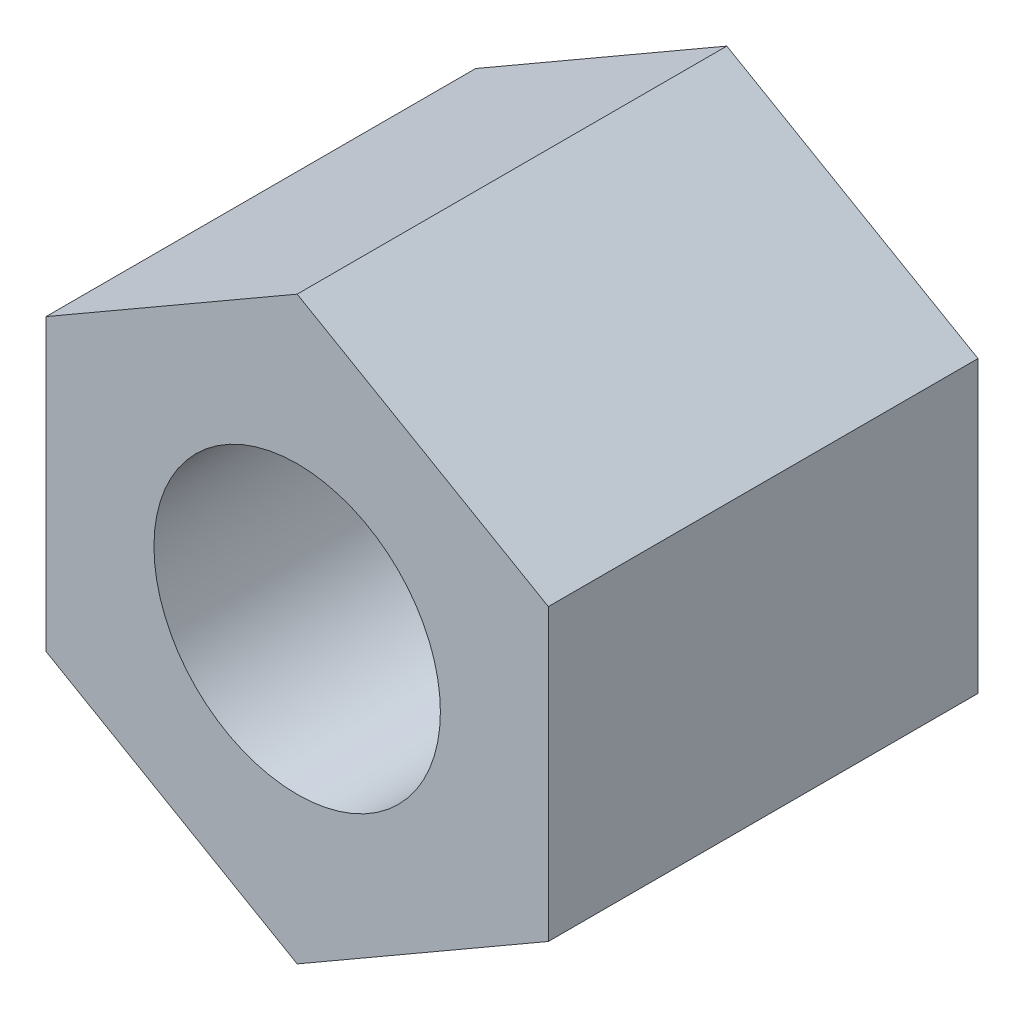
ISO-10303-21;
HEADER;
FILE_DESCRIPTION(('STEP AP214'),'2;1');
FILE_NAME('part.step','',(''),(''),'','','');
FILE_SCHEMA(('AUTOMOTIVE_DESIGN { 1 0 10303 214 1 1 1 1 }'));
ENDSEC;
DATA;
#1=APPLICATION_CONTEXT('core data for automotive mechanical design processes');
#2=APPLICATION_PROTOCOL_DEFINITION('international standard','automotive_design',2000,#1);
#3=PRODUCT_CONTEXT('',#1,'mechanical');
#4=PRODUCT('Part','Part','',(#3));
#5=PRODUCT_RELATED_PRODUCT_CATEGORY('part','',(#4));
#6=PRODUCT_DEFINITION_FORMATION('','',#4);
#7=PRODUCT_DEFINITION_CONTEXT('part definition',#1,'design');
#8=PRODUCT_DEFINITION('design','',#6,#7);
#9=PRODUCT_DEFINITION_SHAPE('','',#8);
#10=(LENGTH_UNIT() NAMED_UNIT(*) SI_UNIT(.MILLI.,.METRE.));
#11=(NAMED_UNIT(*) PLANE_ANGLE_UNIT() SI_UNIT($,.RADIAN.));
#12=(NAMED_UNIT(*) SI_UNIT($,.STERADIAN.) SOLID_ANGLE_UNIT());
#13=UNCERTAINTY_MEASURE_WITH_UNIT(LENGTH_MEASURE(1.E-05),#10,'distance_accuracy_value','');
#14=(GEOMETRIC_REPRESENTATION_CONTEXT(3) GLOBAL_UNCERTAINTY_ASSIGNED_CONTEXT((#13)) GLOBAL_UNIT_ASSIGNED_CONTEXT((#10,
#11,#12)) REPRESENTATION_CONTEXT('',''));
#15=CARTESIAN_POINT('',(0.,0.,0.));
#16=DIRECTION('',(0.,0.,1.));
#17=DIRECTION('',(1.,0.,0.));
#18=AXIS2_PLACEMENT_3D('',#15,#16,#17);
#19=CARTESIAN_POINT('',(1.75370144266349,3.0375,6.));
#20=DIRECTION('',(-0.5,-0.866025403784438,0.));
#21=DIRECTION('',(0.866025403784439,-0.5,0.));
#22=AXIS2_PLACEMENT_3D('',#19,#20,#21);
#23=PLANE('',#22);
#24=DIRECTION('',(-0.866025403784439,0.5,0.));
#25=VECTOR('',#24,1.);
#26=CARTESIAN_POINT('',(1.75370144266349,3.0375,0.));
#27=LINE('',#26,#25);
#28=CARTESIAN_POINT('',(3.50740288532697,2.025,0.));
#29=VERTEX_POINT('',#28);
#30=CARTESIAN_POINT('',(0.,4.05,0.));
#31=VERTEX_POINT('',#30);
#32=EDGE_CURVE('E129',#29,#31,#27,.T.);
#33=ORIENTED_EDGE('',*,*,#32,.T.);
#34=DIRECTION('',(0.,0.,-1.));
#35=VECTOR('',#34,1.);
#36=CARTESIAN_POINT('',(0.,4.05,6.));
#37=LINE('',#36,#35);
#38=CARTESIAN_POINT('',(0.,4.05,6.));
#39=VERTEX_POINT('',#38);
#40=EDGE_CURVE('E11',#39,#31,#37,.T.);
#41=ORIENTED_EDGE('',*,*,#40,.F.);
#42=DIRECTION('',(-0.866025403784439,0.5,0.));
#43=VECTOR('',#42,1.);
#44=CARTESIAN_POINT('',(1.75370144266349,3.0375,6.));
#45=LINE('',#44,#43);
#46=CARTESIAN_POINT('',(3.50740288532697,2.025,6.));
#47=VERTEX_POINT('',#46);
#48=EDGE_CURVE('E142',#47,#39,#45,.T.);
#49=ORIENTED_EDGE('',*,*,#48,.F.);
#50=DIRECTION('',(0.,0.,-1.));
#51=VECTOR('',#50,1.);
#52=CARTESIAN_POINT('',(3.50740288532697,2.025,6.));
#53=LINE('',#52,#51);
#54=EDGE_CURVE('E128',#47,#29,#53,.T.);
#55=ORIENTED_EDGE('',*,*,#54,.T.);
#56=EDGE_LOOP('',(#33,#41,#49,#55));
#57=FACE_BOUND('',#56,.T.);
#58=ADVANCED_FACE('F41',(#57),#23,.F.);
#59=CARTESIAN_POINT('',(-1.75370144266348,3.0375,6.));
#60=DIRECTION('',(0.499999999999999,-0.866025403784439,0.));
#61=DIRECTION('',(0.866025403784439,0.499999999999999,0.));
#62=AXIS2_PLACEMENT_3D('',#59,#60,#61);
#63=PLANE('',#62);
#64=DIRECTION('',(-0.86602540378444,-0.499999999999999,0.));
#65=VECTOR('',#64,1.);
#66=CARTESIAN_POINT('',(-1.75370144266348,3.0375,0.));
#67=LINE('',#66,#65);
#68=CARTESIAN_POINT('',(-3.50740288532698,2.025,0.));
#69=VERTEX_POINT('',#68);
#70=EDGE_CURVE('E132',#31,#69,#67,.T.);
#71=ORIENTED_EDGE('',*,*,#70,.T.);
#72=DIRECTION('',(0.,0.,-1.));
#73=VECTOR('',#72,1.);
#74=CARTESIAN_POINT('',(-3.50740288532698,2.025,6.));
#75=LINE('',#74,#73);
#76=CARTESIAN_POINT('',(-3.50740288532698,2.025,6.));
#77=VERTEX_POINT('',#76);
#78=EDGE_CURVE('E49',#77,#69,#75,.T.);
#79=ORIENTED_EDGE('',*,*,#78,.F.);
#80=DIRECTION('',(-0.86602540378444,-0.499999999999999,0.));
#81=VECTOR('',#80,1.);
#82=CARTESIAN_POINT('',(-1.75370144266348,3.0375,6.));
#83=LINE('',#82,#81);
#84=EDGE_CURVE('E94',#39,#77,#83,.T.);
#85=ORIENTED_EDGE('',*,*,#84,.F.);
#86=ORIENTED_EDGE('',*,*,#40,.T.);
#87=EDGE_LOOP('',(#71,#79,#85,#86));
#88=FACE_BOUND('',#87,.T.);
#89=ADVANCED_FACE('F168',(#88),#63,.F.);
#90=CARTESIAN_POINT('',(-3.50740288532698,0.,6.));
#91=DIRECTION('',(1.,0.,0.));
#92=DIRECTION('',(0.,0.,-1.));
#93=AXIS2_PLACEMENT_3D('',#90,#91,#92);
#94=PLANE('',#93);
#95=DIRECTION('',(0.,-1.,0.));
#96=VECTOR('',#95,1.);
#97=CARTESIAN_POINT('',(-3.50740288532698,0.,0.));
#98=LINE('',#97,#96);
#99=CARTESIAN_POINT('',(-3.50740288532698,-2.025,0.));
#100=VERTEX_POINT('',#99);
#101=EDGE_CURVE('E134',#69,#100,#98,.T.);
#102=ORIENTED_EDGE('',*,*,#101,.T.);
#103=DIRECTION('',(0.,0.,-1.));
#104=VECTOR('',#103,1.);
#105=CARTESIAN_POINT('',(-3.50740288532698,-2.025,6.));
#106=LINE('',#105,#104);
#107=CARTESIAN_POINT('',(-3.50740288532698,-2.025,6.));
#108=VERTEX_POINT('',#107);
#109=EDGE_CURVE('E117',#108,#100,#106,.T.);
#110=ORIENTED_EDGE('',*,*,#109,.F.);
#111=DIRECTION('',(0.,-1.,0.));
#112=VECTOR('',#111,1.);
#113=CARTESIAN_POINT('',(-3.50740288532698,0.,6.));
#114=LINE('',#113,#112);
#115=EDGE_CURVE('E108',#77,#108,#114,.T.);
#116=ORIENTED_EDGE('',*,*,#115,.F.);
#117=ORIENTED_EDGE('',*,*,#78,.T.);
#118=EDGE_LOOP('',(#102,#110,#116,#117));
#119=FACE_BOUND('',#118,.T.);
#120=ADVANCED_FACE('F148',(#119),#94,.F.);
#121=CARTESIAN_POINT('',(-1.75370144266348,-3.0375,6.));
#122=DIRECTION('',(0.499999999999999,0.866025403784439,0.));
#123=DIRECTION('',(-0.866025403784439,0.499999999999999,0.));
#124=AXIS2_PLACEMENT_3D('',#121,#122,#123);
#125=PLANE('',#124);
#126=DIRECTION('',(0.866025403784439,-0.499999999999999,0.));
#127=VECTOR('',#126,1.);
#128=CARTESIAN_POINT('',(-1.75370144266348,-3.0375,0.));
#129=LINE('',#128,#127);
#130=CARTESIAN_POINT('',(0.,-4.05,0.));
#131=VERTEX_POINT('',#130);
#132=EDGE_CURVE('E116',#100,#131,#129,.T.);
#133=ORIENTED_EDGE('',*,*,#132,.T.);
#134=DIRECTION('',(0.,0.,-1.));
#135=VECTOR('',#134,1.);
#136=CARTESIAN_POINT('',(0.,-4.05,6.));
#137=LINE('',#136,#135);
#138=CARTESIAN_POINT('',(0.,-4.05,6.));
#139=VERTEX_POINT('',#138);
#140=EDGE_CURVE('E113',#139,#131,#137,.T.);
#141=ORIENTED_EDGE('',*,*,#140,.F.);
#142=DIRECTION('',(0.866025403784439,-0.499999999999999,0.));
#143=VECTOR('',#142,1.);
#144=CARTESIAN_POINT('',(-1.75370144266348,-3.0375,6.));
#145=LINE('',#144,#143);
#146=EDGE_CURVE('E101',#108,#139,#145,.T.);
#147=ORIENTED_EDGE('',*,*,#146,.F.);
#148=ORIENTED_EDGE('',*,*,#109,.T.);
#149=EDGE_LOOP('',(#133,#141,#147,#148));
#150=FACE_BOUND('',#149,.T.);
#151=ADVANCED_FACE('F114',(#150),#125,.F.);
#152=CARTESIAN_POINT('',(1.75370144266349,-3.03750000000001,6.));
#153=DIRECTION('',(-0.499999999999999,0.866025403784439,0.));
#154=DIRECTION('',(-0.866025403784439,-0.499999999999999,0.));
#155=AXIS2_PLACEMENT_3D('',#152,#153,#154);
#156=PLANE('',#155);
#157=DIRECTION('',(0.866025403784439,0.499999999999999,0.));
#158=VECTOR('',#157,1.);
#159=CARTESIAN_POINT('',(1.75370144266349,-3.03750000000001,0.));
#160=LINE('',#159,#158);
#161=CARTESIAN_POINT('',(3.50740288532697,-2.02500000000001,0.));
#162=VERTEX_POINT('',#161);
#163=EDGE_CURVE('E80',#131,#162,#160,.T.);
#164=ORIENTED_EDGE('',*,*,#163,.T.);
#165=DIRECTION('',(0.,0.,-1.));
#166=VECTOR('',#165,1.);
#167=CARTESIAN_POINT('',(3.50740288532697,-2.02500000000001,6.));
#168=LINE('',#167,#166);
#169=CARTESIAN_POINT('',(3.50740288532697,-2.02500000000001,6.));
#170=VERTEX_POINT('',#169);
#171=EDGE_CURVE('E118',#170,#162,#168,.T.);
#172=ORIENTED_EDGE('',*,*,#171,.F.);
#173=DIRECTION('',(0.866025403784439,0.499999999999999,0.));
#174=VECTOR('',#173,1.);
#175=CARTESIAN_POINT('',(1.75370144266349,-3.03750000000001,6.));
#176=LINE('',#175,#174);
#177=EDGE_CURVE('E106',#139,#170,#176,.T.);
#178=ORIENTED_EDGE('',*,*,#177,.F.);
#179=ORIENTED_EDGE('',*,*,#140,.T.);
#180=EDGE_LOOP('',(#164,#172,#178,#179));
#181=FACE_BOUND('',#180,.T.);
#182=ADVANCED_FACE('F120',(#181),#156,.F.);
#183=CARTESIAN_POINT('',(3.50740288532697,0.,6.));
#184=DIRECTION('',(-1.,0.,0.));
#185=DIRECTION('',(0.,0.,1.));
#186=AXIS2_PLACEMENT_3D('',#183,#184,#185);
#187=PLANE('',#186);
#188=DIRECTION('',(0.,1.,0.));
#189=VECTOR('',#188,1.);
#190=CARTESIAN_POINT('',(3.50740288532697,0.,0.));
#191=LINE('',#190,#189);
#192=EDGE_CURVE('E86',#162,#29,#191,.T.);
#193=ORIENTED_EDGE('',*,*,#192,.T.);
#194=ORIENTED_EDGE('',*,*,#54,.F.);
#195=DIRECTION('',(0.,1.,0.));
#196=VECTOR('',#195,1.);
#197=CARTESIAN_POINT('',(3.50740288532697,0.,6.));
#198=LINE('',#197,#196);
#199=EDGE_CURVE('E57',#170,#47,#198,.T.);
#200=ORIENTED_EDGE('',*,*,#199,.F.);
#201=ORIENTED_EDGE('',*,*,#171,.T.);
#202=EDGE_LOOP('',(#193,#194,#200,#201));
#203=FACE_BOUND('',#202,.T.);
#204=ADVANCED_FACE('F156',(#203),#187,.F.);
#205=CARTESIAN_POINT('',(0.,0.,6.));
#206=DIRECTION('',(0.,0.,-1.));
#207=DIRECTION('',(-1.,0.,0.));
#208=AXIS2_PLACEMENT_3D('',#205,#206,#207);
#209=CYLINDRICAL_SURFACE('',#208,2.);
#210=CARTESIAN_POINT('',(0.,0.,6.));
#211=DIRECTION('',(0.,0.,1.));
#212=DIRECTION('',(1.,0.,0.));
#213=AXIS2_PLACEMENT_3D('',#210,#211,#212);
#214=CIRCLE('',#213,2.);
#215=CARTESIAN_POINT('',(2.,0.,6.));
#216=VERTEX_POINT('',#215);
#217=EDGE_CURVE('E122',#216,#216,#214,.T.);
#218=ORIENTED_EDGE('',*,*,#217,.T.);
#219=EDGE_LOOP('',(#218));
#220=FACE_BOUND('',#219,.T.);
#221=CARTESIAN_POINT('',(0.,0.,0.));
#222=DIRECTION('',(0.,0.,1.));
#223=DIRECTION('',(1.,0.,0.));
#224=AXIS2_PLACEMENT_3D('',#221,#222,#223);
#225=CIRCLE('',#224,2.);
#226=CARTESIAN_POINT('',(2.,0.,0.));
#227=VERTEX_POINT('',#226);
#228=EDGE_CURVE('E139',#227,#227,#225,.T.);
#229=ORIENTED_EDGE('',*,*,#228,.F.);
#230=EDGE_LOOP('',(#229));
#231=FACE_BOUND('',#230,.T.);
#232=ADVANCED_FACE('F158',(#220,#231),#209,.F.);
#233=CARTESIAN_POINT('',(0.,0.,6.));
#234=DIRECTION('',(0.,0.,1.));
#235=DIRECTION('',(1.,0.,0.));
#236=AXIS2_PLACEMENT_3D('',#233,#234,#235);
#237=PLANE('',#236);
#238=ORIENTED_EDGE('',*,*,#48,.T.);
#239=ORIENTED_EDGE('',*,*,#84,.T.);
#240=ORIENTED_EDGE('',*,*,#115,.T.);
#241=ORIENTED_EDGE('',*,*,#146,.T.);
#242=ORIENTED_EDGE('',*,*,#177,.T.);
#243=ORIENTED_EDGE('',*,*,#199,.T.);
#244=EDGE_LOOP('',(#238,#239,#240,#241,#242,#243));
#245=FACE_BOUND('',#244,.T.);
#246=ORIENTED_EDGE('',*,*,#217,.F.);
#247=EDGE_LOOP('',(#246));
#248=FACE_BOUND('',#247,.T.);
#249=ADVANCED_FACE('F103',(#245,#248),#237,.T.);
#250=CARTESIAN_POINT('',(0.,0.,0.));
#251=DIRECTION('',(0.,0.,1.));
#252=DIRECTION('',(1.,0.,0.));
#253=AXIS2_PLACEMENT_3D('',#250,#251,#252);
#254=PLANE('',#253);
#255=ORIENTED_EDGE('',*,*,#32,.F.);
#256=ORIENTED_EDGE('',*,*,#192,.F.);
#257=ORIENTED_EDGE('',*,*,#163,.F.);
#258=ORIENTED_EDGE('',*,*,#132,.F.);
#259=ORIENTED_EDGE('',*,*,#101,.F.);
#260=ORIENTED_EDGE('',*,*,#70,.F.);
#261=EDGE_LOOP('',(#255,#256,#257,#258,#259,#260));
#262=FACE_BOUND('',#261,.T.);
#263=ORIENTED_EDGE('',*,*,#228,.T.);
#264=EDGE_LOOP('',(#263));
#265=FACE_BOUND('',#264,.T.);
#266=ADVANCED_FACE('F151',(#262,#265),#254,.F.);
#267=CLOSED_SHELL('',(#58,#89,#120,#151,#182,#204,#232,#249,#266));
#268=MANIFOLD_SOLID_BREP('B2',#267);
#269=ADVANCED_BREP_SHAPE_REPRESENTATION('',(#18,#268),#14);
#270=SHAPE_DEFINITION_REPRESENTATION(#9,#269);
ENDSEC;
END-ISO-10303-21;
